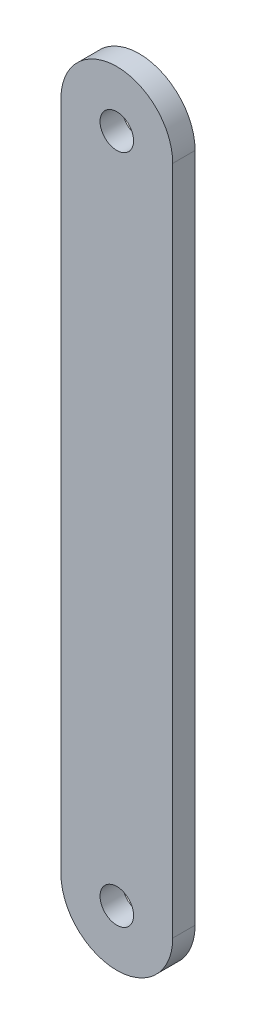
ISO-10303-21;
HEADER;
FILE_DESCRIPTION(('STEP AP214'),'2;1');
FILE_NAME('part.step','',(''),(''),'','','');
FILE_SCHEMA(('AUTOMOTIVE_DESIGN { 1 0 10303 214 1 1 1 1 }'));
ENDSEC;
DATA;
#1=APPLICATION_CONTEXT('core data for automotive mechanical design processes');
#2=APPLICATION_PROTOCOL_DEFINITION('international standard','automotive_design',2000,#1);
#3=PRODUCT_CONTEXT('',#1,'mechanical');
#4=PRODUCT('Part','Part','',(#3));
#5=PRODUCT_RELATED_PRODUCT_CATEGORY('part','',(#4));
#6=PRODUCT_DEFINITION_FORMATION('','',#4);
#7=PRODUCT_DEFINITION_CONTEXT('part definition',#1,'design');
#8=PRODUCT_DEFINITION('design','',#6,#7);
#9=PRODUCT_DEFINITION_SHAPE('','',#8);
#10=(LENGTH_UNIT() NAMED_UNIT(*) SI_UNIT(.MILLI.,.METRE.));
#11=(NAMED_UNIT(*) PLANE_ANGLE_UNIT() SI_UNIT($,.RADIAN.));
#12=(NAMED_UNIT(*) SI_UNIT($,.STERADIAN.) SOLID_ANGLE_UNIT());
#13=UNCERTAINTY_MEASURE_WITH_UNIT(LENGTH_MEASURE(1.E-05),#10,'distance_accuracy_value','');
#14=(GEOMETRIC_REPRESENTATION_CONTEXT(3) GLOBAL_UNCERTAINTY_ASSIGNED_CONTEXT((#13)) GLOBAL_UNIT_ASSIGNED_CONTEXT((#10,
#11,#12)) REPRESENTATION_CONTEXT('',''));
#15=CARTESIAN_POINT('',(0.,0.,0.));
#16=DIRECTION('',(0.,0.,1.));
#17=DIRECTION('',(1.,0.,0.));
#18=AXIS2_PLACEMENT_3D('',#15,#16,#17);
#19=CARTESIAN_POINT('',(0.,-30.,2.));
#20=DIRECTION('',(0.,0.,1.));
#21=DIRECTION('',(1.,0.,0.));
#22=AXIS2_PLACEMENT_3D('',#19,#20,#21);
#23=PLANE('',#22);
#24=CARTESIAN_POINT('',(0.,30.,2.));
#25=DIRECTION('',(0.,0.,1.));
#26=DIRECTION('',(1.,0.,0.));
#27=AXIS2_PLACEMENT_3D('',#24,#25,#26);
#28=CIRCLE('',#27,1.5);
#29=CARTESIAN_POINT('',(1.5,30.,2.));
#30=VERTEX_POINT('',#29);
#31=EDGE_CURVE('E112',#30,#30,#28,.T.);
#32=ORIENTED_EDGE('',*,*,#31,.F.);
#33=EDGE_LOOP('',(#32));
#34=FACE_BOUND('',#33,.T.);
#35=CARTESIAN_POINT('',(0.,-30.,2.));
#36=DIRECTION('',(0.,0.,1.));
#37=DIRECTION('',(1.,0.,0.));
#38=AXIS2_PLACEMENT_3D('',#35,#36,#37);
#39=CIRCLE('',#38,5.);
#40=CARTESIAN_POINT('',(-4.99999999999999,-30.,2.));
#41=VERTEX_POINT('',#40);
#42=CARTESIAN_POINT('',(5.00000000000001,-30.,2.));
#43=VERTEX_POINT('',#42);
#44=EDGE_CURVE('E92',#41,#43,#39,.T.);
#45=ORIENTED_EDGE('',*,*,#44,.T.);
#46=DIRECTION('',(0.,1.,0.));
#47=VECTOR('',#46,1.);
#48=CARTESIAN_POINT('',(5.00000000000001,-30.,2.));
#49=LINE('',#48,#47);
#50=CARTESIAN_POINT('',(5.,30.,2.));
#51=VERTEX_POINT('',#50);
#52=EDGE_CURVE('E87',#43,#51,#49,.T.);
#53=ORIENTED_EDGE('',*,*,#52,.T.);
#54=CARTESIAN_POINT('',(0.,30.,2.));
#55=DIRECTION('',(0.,0.,1.));
#56=DIRECTION('',(1.,0.,0.));
#57=AXIS2_PLACEMENT_3D('',#54,#55,#56);
#58=CIRCLE('',#57,5.);
#59=CARTESIAN_POINT('',(-4.99999999999999,30.,2.));
#60=VERTEX_POINT('',#59);
#61=EDGE_CURVE('E90',#51,#60,#58,.T.);
#62=ORIENTED_EDGE('',*,*,#61,.T.);
#63=DIRECTION('',(0.,-1.,0.));
#64=VECTOR('',#63,1.);
#65=CARTESIAN_POINT('',(-4.99999999999999,-30.,2.));
#66=LINE('',#65,#64);
#67=EDGE_CURVE('E57',#60,#41,#66,.T.);
#68=ORIENTED_EDGE('',*,*,#67,.T.);
#69=EDGE_LOOP('',(#45,#53,#62,#68));
#70=FACE_BOUND('',#69,.T.);
#71=CARTESIAN_POINT('',(0.,-30.,2.));
#72=DIRECTION('',(0.,0.,1.));
#73=DIRECTION('',(-1.,0.,0.));
#74=AXIS2_PLACEMENT_3D('',#71,#72,#73);
#75=CIRCLE('',#74,1.5);
#76=CARTESIAN_POINT('',(-1.5,-30.,2.));
#77=VERTEX_POINT('',#76);
#78=EDGE_CURVE('E134',#77,#77,#75,.T.);
#79=ORIENTED_EDGE('',*,*,#78,.F.);
#80=EDGE_LOOP('',(#79));
#81=FACE_BOUND('',#80,.T.);
#82=ADVANCED_FACE('F39',(#34,#70,#81),#23,.T.);
#83=CARTESIAN_POINT('',(0.,-30.,0.));
#84=DIRECTION('',(0.,0.,1.));
#85=DIRECTION('',(1.,0.,0.));
#86=AXIS2_PLACEMENT_3D('',#83,#84,#85);
#87=PLANE('',#86);
#88=CARTESIAN_POINT('',(0.,-30.,0.));
#89=DIRECTION('',(0.,0.,1.));
#90=DIRECTION('',(1.,0.,0.));
#91=AXIS2_PLACEMENT_3D('',#88,#89,#90);
#92=CIRCLE('',#91,5.);
#93=CARTESIAN_POINT('',(-4.99999999999999,-30.,0.));
#94=VERTEX_POINT('',#93);
#95=CARTESIAN_POINT('',(5.00000000000001,-30.,0.));
#96=VERTEX_POINT('',#95);
#97=EDGE_CURVE('E108',#94,#96,#92,.T.);
#98=ORIENTED_EDGE('',*,*,#97,.F.);
#99=DIRECTION('',(0.,-1.,0.));
#100=VECTOR('',#99,1.);
#101=CARTESIAN_POINT('',(-4.99999999999999,-30.,0.));
#102=LINE('',#101,#100);
#103=CARTESIAN_POINT('',(-4.99999999999999,30.,0.));
#104=VERTEX_POINT('',#103);
#105=EDGE_CURVE('E80',#104,#94,#102,.T.);
#106=ORIENTED_EDGE('',*,*,#105,.F.);
#107=CARTESIAN_POINT('',(0.,30.,0.));
#108=DIRECTION('',(0.,0.,1.));
#109=DIRECTION('',(1.,0.,0.));
#110=AXIS2_PLACEMENT_3D('',#107,#108,#109);
#111=CIRCLE('',#110,5.);
#112=CARTESIAN_POINT('',(5.,30.,0.));
#113=VERTEX_POINT('',#112);
#114=EDGE_CURVE('E74',#113,#104,#111,.T.);
#115=ORIENTED_EDGE('',*,*,#114,.F.);
#116=DIRECTION('',(0.,1.,0.));
#117=VECTOR('',#116,1.);
#118=CARTESIAN_POINT('',(5.00000000000001,-30.,0.));
#119=LINE('',#118,#117);
#120=EDGE_CURVE('E97',#96,#113,#119,.T.);
#121=ORIENTED_EDGE('',*,*,#120,.F.);
#122=EDGE_LOOP('',(#98,#106,#115,#121));
#123=FACE_BOUND('',#122,.T.);
#124=CARTESIAN_POINT('',(0.,30.,0.));
#125=DIRECTION('',(0.,0.,1.));
#126=DIRECTION('',(1.,0.,0.));
#127=AXIS2_PLACEMENT_3D('',#124,#125,#126);
#128=CIRCLE('',#127,1.5);
#129=CARTESIAN_POINT('',(1.5,30.,0.));
#130=VERTEX_POINT('',#129);
#131=EDGE_CURVE('E130',#130,#130,#128,.T.);
#132=ORIENTED_EDGE('',*,*,#131,.T.);
#133=EDGE_LOOP('',(#132));
#134=FACE_BOUND('',#133,.T.);
#135=CARTESIAN_POINT('',(0.,-30.,0.));
#136=DIRECTION('',(0.,0.,1.));
#137=DIRECTION('',(-1.,0.,0.));
#138=AXIS2_PLACEMENT_3D('',#135,#136,#137);
#139=CIRCLE('',#138,1.5);
#140=CARTESIAN_POINT('',(-1.5,-30.,0.));
#141=VERTEX_POINT('',#140);
#142=EDGE_CURVE('E138',#141,#141,#139,.T.);
#143=ORIENTED_EDGE('',*,*,#142,.T.);
#144=EDGE_LOOP('',(#143));
#145=FACE_BOUND('',#144,.T.);
#146=ADVANCED_FACE('F125',(#123,#134,#145),#87,.F.);
#147=CARTESIAN_POINT('',(0.,-30.,2.));
#148=DIRECTION('',(0.,0.,-1.));
#149=DIRECTION('',(-1.,0.,0.));
#150=AXIS2_PLACEMENT_3D('',#147,#148,#149);
#151=CYLINDRICAL_SURFACE('',#150,5.);
#152=ORIENTED_EDGE('',*,*,#97,.T.);
#153=DIRECTION('',(0.,0.,-1.));
#154=VECTOR('',#153,1.);
#155=CARTESIAN_POINT('',(5.00000000000001,-30.,2.));
#156=LINE('',#155,#154);
#157=EDGE_CURVE('E11',#43,#96,#156,.T.);
#158=ORIENTED_EDGE('',*,*,#157,.F.);
#159=ORIENTED_EDGE('',*,*,#44,.F.);
#160=DIRECTION('',(0.,0.,-1.));
#161=VECTOR('',#160,1.);
#162=CARTESIAN_POINT('',(-4.99999999999999,-30.,2.));
#163=LINE('',#162,#161);
#164=EDGE_CURVE('E104',#41,#94,#163,.T.);
#165=ORIENTED_EDGE('',*,*,#164,.T.);
#166=EDGE_LOOP('',(#152,#158,#159,#165));
#167=FACE_BOUND('',#166,.T.);
#168=ADVANCED_FACE('F41',(#167),#151,.T.);
#169=CARTESIAN_POINT('',(5.00000000000001,-30.,2.));
#170=DIRECTION('',(-1.,0.,0.));
#171=DIRECTION('',(0.,-1.,0.));
#172=AXIS2_PLACEMENT_3D('',#169,#170,#171);
#173=PLANE('',#172);
#174=ORIENTED_EDGE('',*,*,#120,.T.);
#175=DIRECTION('',(0.,0.,-1.));
#176=VECTOR('',#175,1.);
#177=CARTESIAN_POINT('',(5.,30.,2.));
#178=LINE('',#177,#176);
#179=EDGE_CURVE('E49',#51,#113,#178,.T.);
#180=ORIENTED_EDGE('',*,*,#179,.F.);
#181=ORIENTED_EDGE('',*,*,#52,.F.);
#182=ORIENTED_EDGE('',*,*,#157,.T.);
#183=EDGE_LOOP('',(#174,#180,#181,#182));
#184=FACE_BOUND('',#183,.T.);
#185=ADVANCED_FACE('F96',(#184),#173,.F.);
#186=CARTESIAN_POINT('',(0.,30.,2.));
#187=DIRECTION('',(0.,0.,-1.));
#188=DIRECTION('',(-1.,0.,0.));
#189=AXIS2_PLACEMENT_3D('',#186,#187,#188);
#190=CYLINDRICAL_SURFACE('',#189,5.);
#191=ORIENTED_EDGE('',*,*,#114,.T.);
#192=DIRECTION('',(0.,0.,-1.));
#193=VECTOR('',#192,1.);
#194=CARTESIAN_POINT('',(-4.99999999999999,30.,2.));
#195=LINE('',#194,#193);
#196=EDGE_CURVE('E99',#60,#104,#195,.T.);
#197=ORIENTED_EDGE('',*,*,#196,.F.);
#198=ORIENTED_EDGE('',*,*,#61,.F.);
#199=ORIENTED_EDGE('',*,*,#179,.T.);
#200=EDGE_LOOP('',(#191,#197,#198,#199));
#201=FACE_BOUND('',#200,.T.);
#202=ADVANCED_FACE('F100',(#201),#190,.T.);
#203=CARTESIAN_POINT('',(-4.99999999999999,-30.,2.));
#204=DIRECTION('',(1.,0.,0.));
#205=DIRECTION('',(0.,1.,0.));
#206=AXIS2_PLACEMENT_3D('',#203,#204,#205);
#207=PLANE('',#206);
#208=ORIENTED_EDGE('',*,*,#105,.T.);
#209=ORIENTED_EDGE('',*,*,#164,.F.);
#210=ORIENTED_EDGE('',*,*,#67,.F.);
#211=ORIENTED_EDGE('',*,*,#196,.T.);
#212=EDGE_LOOP('',(#208,#209,#210,#211));
#213=FACE_BOUND('',#212,.T.);
#214=ADVANCED_FACE('F122',(#213),#207,.F.);
#215=CARTESIAN_POINT('',(0.,30.,2.));
#216=DIRECTION('',(0.,0.,-1.));
#217=DIRECTION('',(-1.,0.,0.));
#218=AXIS2_PLACEMENT_3D('',#215,#216,#217);
#219=CYLINDRICAL_SURFACE('',#218,1.5);
#220=ORIENTED_EDGE('',*,*,#31,.T.);
#221=EDGE_LOOP('',(#220));
#222=FACE_BOUND('',#221,.T.);
#223=ORIENTED_EDGE('',*,*,#131,.F.);
#224=EDGE_LOOP('',(#223));
#225=FACE_BOUND('',#224,.T.);
#226=ADVANCED_FACE('F157',(#222,#225),#219,.F.);
#227=CARTESIAN_POINT('',(0.,-30.,2.));
#228=DIRECTION('',(0.,0.,-1.));
#229=DIRECTION('',(-1.,0.,0.));
#230=AXIS2_PLACEMENT_3D('',#227,#228,#229);
#231=CYLINDRICAL_SURFACE('',#230,1.5);
#232=ORIENTED_EDGE('',*,*,#78,.T.);
#233=EDGE_LOOP('',(#232));
#234=FACE_BOUND('',#233,.T.);
#235=ORIENTED_EDGE('',*,*,#142,.F.);
#236=EDGE_LOOP('',(#235));
#237=FACE_BOUND('',#236,.T.);
#238=ADVANCED_FACE('F146',(#234,#237),#231,.F.);
#239=CLOSED_SHELL('',(#82,#146,#168,#185,#202,#214,#226,#238));
#240=MANIFOLD_SOLID_BREP('B2',#239);
#241=ADVANCED_BREP_SHAPE_REPRESENTATION('',(#18,#240),#14);
#242=SHAPE_DEFINITION_REPRESENTATION(#9,#241);
ENDSEC;
END-ISO-10303-21;
